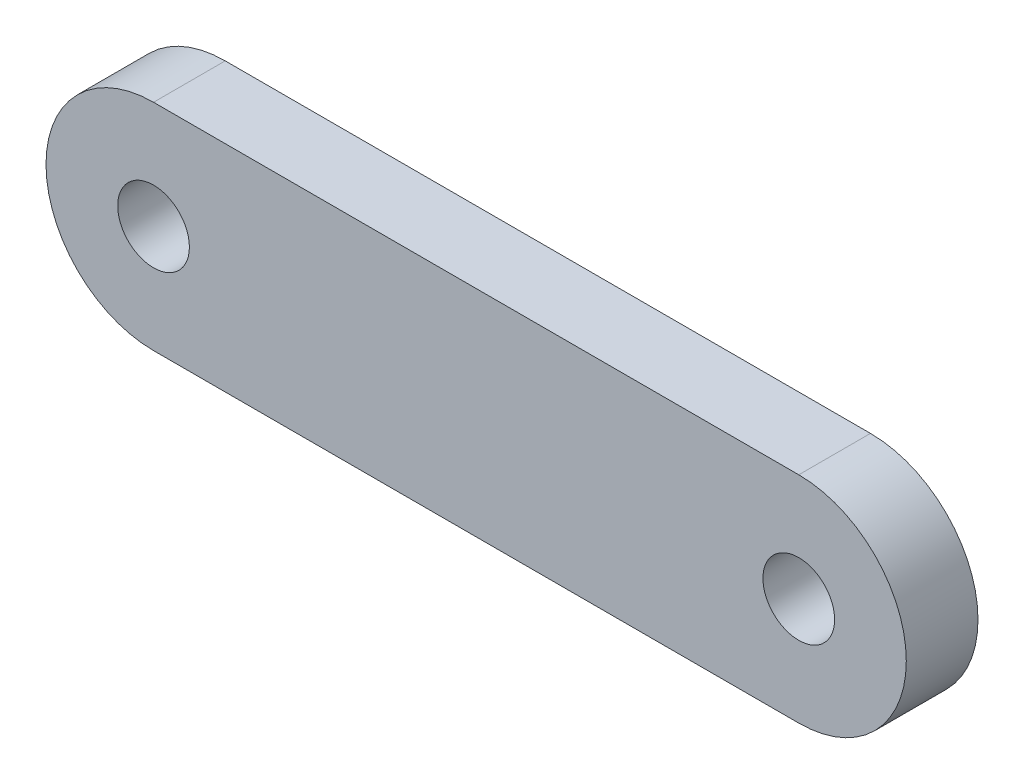
ISO-10303-21;
HEADER;
FILE_DESCRIPTION(('STEP AP214'),'2;1');
FILE_NAME('part.step','',(''),(''),'','','');
FILE_SCHEMA(('AUTOMOTIVE_DESIGN { 1 0 10303 214 1 1 1 1 }'));
ENDSEC;
DATA;
#1=APPLICATION_CONTEXT('core data for automotive mechanical design processes');
#2=APPLICATION_PROTOCOL_DEFINITION('international standard','automotive_design',2000,#1);
#3=PRODUCT_CONTEXT('',#1,'mechanical');
#4=PRODUCT('Part','Part','',(#3));
#5=PRODUCT_RELATED_PRODUCT_CATEGORY('part','',(#4));
#6=PRODUCT_DEFINITION_FORMATION('','',#4);
#7=PRODUCT_DEFINITION_CONTEXT('part definition',#1,'design');
#8=PRODUCT_DEFINITION('design','',#6,#7);
#9=PRODUCT_DEFINITION_SHAPE('','',#8);
#10=(LENGTH_UNIT() NAMED_UNIT(*) SI_UNIT(.MILLI.,.METRE.));
#11=(NAMED_UNIT(*) PLANE_ANGLE_UNIT() SI_UNIT($,.RADIAN.));
#12=(NAMED_UNIT(*) SI_UNIT($,.STERADIAN.) SOLID_ANGLE_UNIT());
#13=UNCERTAINTY_MEASURE_WITH_UNIT(LENGTH_MEASURE(1.E-05),#10,'distance_accuracy_value','');
#14=(GEOMETRIC_REPRESENTATION_CONTEXT(3) GLOBAL_UNCERTAINTY_ASSIGNED_CONTEXT((#13)) GLOBAL_UNIT_ASSIGNED_CONTEXT((#10,
#11,#12)) REPRESENTATION_CONTEXT('',''));
#15=CARTESIAN_POINT('',(0.,0.,0.));
#16=DIRECTION('',(0.,0.,1.));
#17=DIRECTION('',(1.,0.,0.));
#18=AXIS2_PLACEMENT_3D('',#15,#16,#17);
#19=CARTESIAN_POINT('',(-45.,0.,10.));
#20=DIRECTION('',(0.,0.,1.));
#21=DIRECTION('',(1.,0.,0.));
#22=AXIS2_PLACEMENT_3D('',#19,#20,#21);
#23=PLANE('',#22);
#24=CARTESIAN_POINT('',(-45.,0.,10.));
#25=DIRECTION('',(0.,0.,1.));
#26=DIRECTION('',(1.,0.,0.));
#27=AXIS2_PLACEMENT_3D('',#24,#25,#26);
#28=CIRCLE('',#27,5.);
#29=CARTESIAN_POINT('',(-40.,0.,10.));
#30=VERTEX_POINT('',#29);
#31=EDGE_CURVE('E112',#30,#30,#28,.T.);
#32=ORIENTED_EDGE('',*,*,#31,.F.);
#33=EDGE_LOOP('',(#32));
#34=FACE_BOUND('',#33,.T.);
#35=CARTESIAN_POINT('',(-45.,0.,10.));
#36=DIRECTION('',(0.,0.,1.));
#37=DIRECTION('',(1.,0.,0.));
#38=AXIS2_PLACEMENT_3D('',#35,#36,#37);
#39=CIRCLE('',#38,15.);
#40=CARTESIAN_POINT('',(-45.,15.,10.));
#41=VERTEX_POINT('',#40);
#42=CARTESIAN_POINT('',(-45.,-15.,10.));
#43=VERTEX_POINT('',#42);
#44=EDGE_CURVE('E92',#41,#43,#39,.T.);
#45=ORIENTED_EDGE('',*,*,#44,.T.);
#46=DIRECTION('',(1.,0.,0.));
#47=VECTOR('',#46,1.);
#48=CARTESIAN_POINT('',(-45.,-15.,10.));
#49=LINE('',#48,#47);
#50=CARTESIAN_POINT('',(45.,-15.,10.));
#51=VERTEX_POINT('',#50);
#52=EDGE_CURVE('E87',#43,#51,#49,.T.);
#53=ORIENTED_EDGE('',*,*,#52,.T.);
#54=CARTESIAN_POINT('',(45.,0.,10.));
#55=DIRECTION('',(0.,0.,1.));
#56=DIRECTION('',(1.,0.,0.));
#57=AXIS2_PLACEMENT_3D('',#54,#55,#56);
#58=CIRCLE('',#57,15.);
#59=CARTESIAN_POINT('',(45.,15.,10.));
#60=VERTEX_POINT('',#59);
#61=EDGE_CURVE('E90',#51,#60,#58,.T.);
#62=ORIENTED_EDGE('',*,*,#61,.T.);
#63=DIRECTION('',(-1.,0.,0.));
#64=VECTOR('',#63,1.);
#65=CARTESIAN_POINT('',(-45.,15.,10.));
#66=LINE('',#65,#64);
#67=EDGE_CURVE('E57',#60,#41,#66,.T.);
#68=ORIENTED_EDGE('',*,*,#67,.T.);
#69=EDGE_LOOP('',(#45,#53,#62,#68));
#70=FACE_BOUND('',#69,.T.);
#71=CARTESIAN_POINT('',(45.,0.,10.));
#72=DIRECTION('',(0.,0.,1.));
#73=DIRECTION('',(1.,0.,0.));
#74=AXIS2_PLACEMENT_3D('',#71,#72,#73);
#75=CIRCLE('',#74,5.);
#76=CARTESIAN_POINT('',(50.,0.,10.));
#77=VERTEX_POINT('',#76);
#78=EDGE_CURVE('E134',#77,#77,#75,.T.);
#79=ORIENTED_EDGE('',*,*,#78,.F.);
#80=EDGE_LOOP('',(#79));
#81=FACE_BOUND('',#80,.T.);
#82=ADVANCED_FACE('F39',(#34,#70,#81),#23,.T.);
#83=CARTESIAN_POINT('',(-45.,0.,0.));
#84=DIRECTION('',(0.,0.,1.));
#85=DIRECTION('',(1.,0.,0.));
#86=AXIS2_PLACEMENT_3D('',#83,#84,#85);
#87=PLANE('',#86);
#88=CARTESIAN_POINT('',(-45.,0.,0.));
#89=DIRECTION('',(0.,0.,1.));
#90=DIRECTION('',(1.,0.,0.));
#91=AXIS2_PLACEMENT_3D('',#88,#89,#90);
#92=CIRCLE('',#91,15.);
#93=CARTESIAN_POINT('',(-45.,15.,0.));
#94=VERTEX_POINT('',#93);
#95=CARTESIAN_POINT('',(-45.,-15.,0.));
#96=VERTEX_POINT('',#95);
#97=EDGE_CURVE('E108',#94,#96,#92,.T.);
#98=ORIENTED_EDGE('',*,*,#97,.F.);
#99=DIRECTION('',(-1.,0.,0.));
#100=VECTOR('',#99,1.);
#101=CARTESIAN_POINT('',(-45.,15.,0.));
#102=LINE('',#101,#100);
#103=CARTESIAN_POINT('',(45.,15.,0.));
#104=VERTEX_POINT('',#103);
#105=EDGE_CURVE('E80',#104,#94,#102,.T.);
#106=ORIENTED_EDGE('',*,*,#105,.F.);
#107=CARTESIAN_POINT('',(45.,0.,0.));
#108=DIRECTION('',(0.,0.,1.));
#109=DIRECTION('',(1.,0.,0.));
#110=AXIS2_PLACEMENT_3D('',#107,#108,#109);
#111=CIRCLE('',#110,15.);
#112=CARTESIAN_POINT('',(45.,-15.,0.));
#113=VERTEX_POINT('',#112);
#114=EDGE_CURVE('E74',#113,#104,#111,.T.);
#115=ORIENTED_EDGE('',*,*,#114,.F.);
#116=DIRECTION('',(1.,0.,0.));
#117=VECTOR('',#116,1.);
#118=CARTESIAN_POINT('',(-45.,-15.,0.));
#119=LINE('',#118,#117);
#120=EDGE_CURVE('E97',#96,#113,#119,.T.);
#121=ORIENTED_EDGE('',*,*,#120,.F.);
#122=EDGE_LOOP('',(#98,#106,#115,#121));
#123=FACE_BOUND('',#122,.T.);
#124=CARTESIAN_POINT('',(-45.,0.,0.));
#125=DIRECTION('',(0.,0.,1.));
#126=DIRECTION('',(1.,0.,0.));
#127=AXIS2_PLACEMENT_3D('',#124,#125,#126);
#128=CIRCLE('',#127,5.);
#129=CARTESIAN_POINT('',(-40.,0.,0.));
#130=VERTEX_POINT('',#129);
#131=EDGE_CURVE('E130',#130,#130,#128,.T.);
#132=ORIENTED_EDGE('',*,*,#131,.T.);
#133=EDGE_LOOP('',(#132));
#134=FACE_BOUND('',#133,.T.);
#135=CARTESIAN_POINT('',(45.,0.,0.));
#136=DIRECTION('',(0.,0.,1.));
#137=DIRECTION('',(1.,0.,0.));
#138=AXIS2_PLACEMENT_3D('',#135,#136,#137);
#139=CIRCLE('',#138,5.);
#140=CARTESIAN_POINT('',(50.,0.,0.));
#141=VERTEX_POINT('',#140);
#142=EDGE_CURVE('E138',#141,#141,#139,.T.);
#143=ORIENTED_EDGE('',*,*,#142,.T.);
#144=EDGE_LOOP('',(#143));
#145=FACE_BOUND('',#144,.T.);
#146=ADVANCED_FACE('F125',(#123,#134,#145),#87,.F.);
#147=CARTESIAN_POINT('',(-45.,0.,10.));
#148=DIRECTION('',(0.,0.,-1.));
#149=DIRECTION('',(-1.,0.,0.));
#150=AXIS2_PLACEMENT_3D('',#147,#148,#149);
#151=CYLINDRICAL_SURFACE('',#150,15.);
#152=ORIENTED_EDGE('',*,*,#97,.T.);
#153=DIRECTION('',(0.,0.,-1.));
#154=VECTOR('',#153,1.);
#155=CARTESIAN_POINT('',(-45.,-15.,10.));
#156=LINE('',#155,#154);
#157=EDGE_CURVE('E11',#43,#96,#156,.T.);
#158=ORIENTED_EDGE('',*,*,#157,.F.);
#159=ORIENTED_EDGE('',*,*,#44,.F.);
#160=DIRECTION('',(0.,0.,-1.));
#161=VECTOR('',#160,1.);
#162=CARTESIAN_POINT('',(-45.,15.,10.));
#163=LINE('',#162,#161);
#164=EDGE_CURVE('E104',#41,#94,#163,.T.);
#165=ORIENTED_EDGE('',*,*,#164,.T.);
#166=EDGE_LOOP('',(#152,#158,#159,#165));
#167=FACE_BOUND('',#166,.T.);
#168=ADVANCED_FACE('F41',(#167),#151,.T.);
#169=CARTESIAN_POINT('',(-45.,-15.,10.));
#170=DIRECTION('',(0.,1.,0.));
#171=DIRECTION('',(0.,0.,1.));
#172=AXIS2_PLACEMENT_3D('',#169,#170,#171);
#173=PLANE('',#172);
#174=ORIENTED_EDGE('',*,*,#120,.T.);
#175=DIRECTION('',(0.,0.,-1.));
#176=VECTOR('',#175,1.);
#177=CARTESIAN_POINT('',(45.,-15.,10.));
#178=LINE('',#177,#176);
#179=EDGE_CURVE('E49',#51,#113,#178,.T.);
#180=ORIENTED_EDGE('',*,*,#179,.F.);
#181=ORIENTED_EDGE('',*,*,#52,.F.);
#182=ORIENTED_EDGE('',*,*,#157,.T.);
#183=EDGE_LOOP('',(#174,#180,#181,#182));
#184=FACE_BOUND('',#183,.T.);
#185=ADVANCED_FACE('F96',(#184),#173,.F.);
#186=CARTESIAN_POINT('',(45.,0.,10.));
#187=DIRECTION('',(0.,0.,-1.));
#188=DIRECTION('',(-1.,0.,0.));
#189=AXIS2_PLACEMENT_3D('',#186,#187,#188);
#190=CYLINDRICAL_SURFACE('',#189,15.);
#191=ORIENTED_EDGE('',*,*,#114,.T.);
#192=DIRECTION('',(0.,0.,-1.));
#193=VECTOR('',#192,1.);
#194=CARTESIAN_POINT('',(45.,15.,10.));
#195=LINE('',#194,#193);
#196=EDGE_CURVE('E99',#60,#104,#195,.T.);
#197=ORIENTED_EDGE('',*,*,#196,.F.);
#198=ORIENTED_EDGE('',*,*,#61,.F.);
#199=ORIENTED_EDGE('',*,*,#179,.T.);
#200=EDGE_LOOP('',(#191,#197,#198,#199));
#201=FACE_BOUND('',#200,.T.);
#202=ADVANCED_FACE('F100',(#201),#190,.T.);
#203=CARTESIAN_POINT('',(-45.,15.,10.));
#204=DIRECTION('',(0.,-1.,0.));
#205=DIRECTION('',(0.,0.,-1.));
#206=AXIS2_PLACEMENT_3D('',#203,#204,#205);
#207=PLANE('',#206);
#208=ORIENTED_EDGE('',*,*,#105,.T.);
#209=ORIENTED_EDGE('',*,*,#164,.F.);
#210=ORIENTED_EDGE('',*,*,#67,.F.);
#211=ORIENTED_EDGE('',*,*,#196,.T.);
#212=EDGE_LOOP('',(#208,#209,#210,#211));
#213=FACE_BOUND('',#212,.T.);
#214=ADVANCED_FACE('F122',(#213),#207,.F.);
#215=CARTESIAN_POINT('',(-45.,0.,10.));
#216=DIRECTION('',(0.,0.,-1.));
#217=DIRECTION('',(-1.,0.,0.));
#218=AXIS2_PLACEMENT_3D('',#215,#216,#217);
#219=CYLINDRICAL_SURFACE('',#218,5.);
#220=ORIENTED_EDGE('',*,*,#31,.T.);
#221=EDGE_LOOP('',(#220));
#222=FACE_BOUND('',#221,.T.);
#223=ORIENTED_EDGE('',*,*,#131,.F.);
#224=EDGE_LOOP('',(#223));
#225=FACE_BOUND('',#224,.T.);
#226=ADVANCED_FACE('F157',(#222,#225),#219,.F.);
#227=CARTESIAN_POINT('',(45.,0.,10.));
#228=DIRECTION('',(0.,0.,-1.));
#229=DIRECTION('',(-1.,0.,0.));
#230=AXIS2_PLACEMENT_3D('',#227,#228,#229);
#231=CYLINDRICAL_SURFACE('',#230,5.);
#232=ORIENTED_EDGE('',*,*,#78,.T.);
#233=EDGE_LOOP('',(#232));
#234=FACE_BOUND('',#233,.T.);
#235=ORIENTED_EDGE('',*,*,#142,.F.);
#236=EDGE_LOOP('',(#235));
#237=FACE_BOUND('',#236,.T.);
#238=ADVANCED_FACE('F146',(#234,#237),#231,.F.);
#239=CLOSED_SHELL('',(#82,#146,#168,#185,#202,#214,#226,#238));
#240=MANIFOLD_SOLID_BREP('B2',#239);
#241=ADVANCED_BREP_SHAPE_REPRESENTATION('',(#18,#240),#14);
#242=SHAPE_DEFINITION_REPRESENTATION(#9,#241);
ENDSEC;
END-ISO-10303-21;
